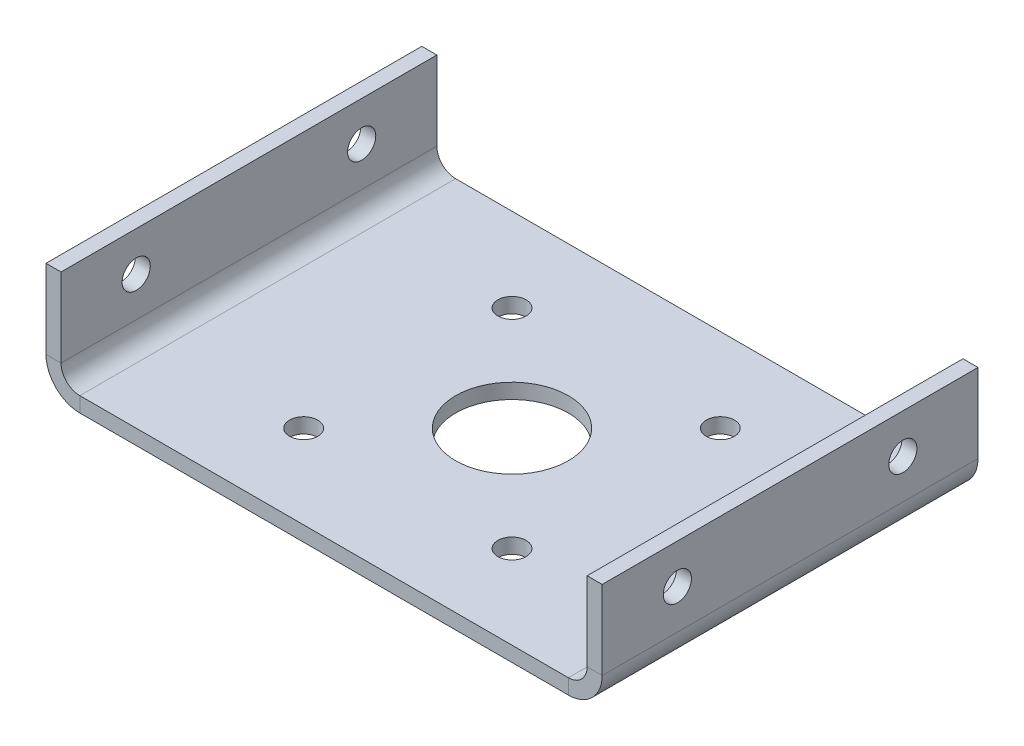
ISO-10303-21;
HEADER;
FILE_DESCRIPTION(('STEP AP214'),'2;1');
FILE_NAME('part.step','',(''),(''),'','','');
FILE_SCHEMA(('AUTOMOTIVE_DESIGN { 1 0 10303 214 1 1 1 1 }'));
ENDSEC;
DATA;
#1=APPLICATION_CONTEXT('core data for automotive mechanical design processes');
#2=APPLICATION_PROTOCOL_DEFINITION('international standard','automotive_design',2000,#1);
#3=PRODUCT_CONTEXT('',#1,'mechanical');
#4=PRODUCT('Part','Part','',(#3));
#5=PRODUCT_RELATED_PRODUCT_CATEGORY('part','',(#4));
#6=PRODUCT_DEFINITION_FORMATION('','',#4);
#7=PRODUCT_DEFINITION_CONTEXT('part definition',#1,'design');
#8=PRODUCT_DEFINITION('design','',#6,#7);
#9=PRODUCT_DEFINITION_SHAPE('','',#8);
#10=(LENGTH_UNIT() NAMED_UNIT(*) SI_UNIT(.MILLI.,.METRE.));
#11=(NAMED_UNIT(*) PLANE_ANGLE_UNIT() SI_UNIT($,.RADIAN.));
#12=(NAMED_UNIT(*) SI_UNIT($,.STERADIAN.) SOLID_ANGLE_UNIT());
#13=UNCERTAINTY_MEASURE_WITH_UNIT(LENGTH_MEASURE(1.E-05),#10,'distance_accuracy_value','');
#14=(GEOMETRIC_REPRESENTATION_CONTEXT(3) GLOBAL_UNCERTAINTY_ASSIGNED_CONTEXT((#13)) GLOBAL_UNIT_ASSIGNED_CONTEXT((#10,
#11,#12)) REPRESENTATION_CONTEXT('',''));
#15=CARTESIAN_POINT('',(0.,0.,0.));
#16=DIRECTION('',(0.,0.,1.));
#17=DIRECTION('',(1.,0.,0.));
#18=AXIS2_PLACEMENT_3D('',#15,#16,#17);
#19=CARTESIAN_POINT('',(0.,-8.,0.));
#20=DIRECTION('',(0.,-1.,0.));
#21=DIRECTION('',(0.,0.,-1.));
#22=AXIS2_PLACEMENT_3D('',#19,#20,#21);
#23=PLANE('',#22);
#24=CARTESIAN_POINT('',(-55.4371716450253,-8.,-55.4371716450253));
#25=DIRECTION('',(0.,1.,0.));
#26=DIRECTION('',(0.,0.,1.));
#27=AXIS2_PLACEMENT_3D('',#24,#25,#26);
#28=CIRCLE('',#27,7.5);
#29=CARTESIAN_POINT('',(-55.4371716450253,-8.,-47.9371716450253));
#30=VERTEX_POINT('',#29);
#31=EDGE_CURVE('E396',#30,#30,#28,.T.);
#32=ORIENTED_EDGE('',*,*,#31,.T.);
#33=EDGE_LOOP('',(#32));
#34=FACE_BOUND('',#33,.T.);
#35=CARTESIAN_POINT('',(55.4371716450253,-8.,-55.4371716450253));
#36=DIRECTION('',(0.,-1.,0.));
#37=DIRECTION('',(0.,0.,1.));
#38=AXIS2_PLACEMENT_3D('',#35,#36,#37);
#39=CIRCLE('',#38,7.5);
#40=CARTESIAN_POINT('',(55.4371716450253,-8.,-47.9371716450253));
#41=VERTEX_POINT('',#40);
#42=EDGE_CURVE('E373',#41,#41,#39,.T.);
#43=ORIENTED_EDGE('',*,*,#42,.F.);
#44=EDGE_LOOP('',(#43));
#45=FACE_BOUND('',#44,.T.);
#46=CARTESIAN_POINT('',(55.4371716450253,-8.,55.4371716450253));
#47=DIRECTION('',(0.,1.,0.));
#48=DIRECTION('',(0.,0.,-1.));
#49=AXIS2_PLACEMENT_3D('',#46,#47,#48);
#50=CIRCLE('',#49,7.5);
#51=CARTESIAN_POINT('',(55.4371716450253,-8.,47.9371716450253));
#52=VERTEX_POINT('',#51);
#53=EDGE_CURVE('E362',#52,#52,#50,.T.);
#54=ORIENTED_EDGE('',*,*,#53,.T.);
#55=EDGE_LOOP('',(#54));
#56=FACE_BOUND('',#55,.T.);
#57=CARTESIAN_POINT('',(-55.4371716450253,-8.,55.4371716450253));
#58=DIRECTION('',(0.,-1.,0.));
#59=DIRECTION('',(0.,0.,-1.));
#60=AXIS2_PLACEMENT_3D('',#57,#58,#59);
#61=CIRCLE('',#60,7.5);
#62=CARTESIAN_POINT('',(-55.4371716450253,-8.,47.9371716450253));
#63=VERTEX_POINT('',#62);
#64=EDGE_CURVE('E357',#63,#63,#61,.T.);
#65=ORIENTED_EDGE('',*,*,#64,.F.);
#66=EDGE_LOOP('',(#65));
#67=FACE_BOUND('',#66,.T.);
#68=CARTESIAN_POINT('',(0.,-8.,0.));
#69=DIRECTION('',(0.,-1.,0.));
#70=DIRECTION('',(0.,0.,-1.));
#71=AXIS2_PLACEMENT_3D('',#68,#69,#70);
#72=CIRCLE('',#71,30.);
#73=CARTESIAN_POINT('',(0.,-8.,-30.));
#74=VERTEX_POINT('',#73);
#75=EDGE_CURVE('E352',#74,#74,#72,.T.);
#76=ORIENTED_EDGE('',*,*,#75,.F.);
#77=EDGE_LOOP('',(#76));
#78=FACE_BOUND('',#77,.T.);
#79=DIRECTION('',(-1.,0.,0.));
#80=VECTOR('',#79,1.);
#81=CARTESIAN_POINT('',(-148.,-8.,-100.));
#82=LINE('',#81,#80);
#83=CARTESIAN_POINT('',(130.,-8.00000000000002,-100.));
#84=VERTEX_POINT('',#83);
#85=CARTESIAN_POINT('',(-130.,-8.,-100.));
#86=VERTEX_POINT('',#85);
#87=EDGE_CURVE('E104',#84,#86,#82,.T.);
#88=ORIENTED_EDGE('',*,*,#87,.F.);
#89=DIRECTION('',(0.,0.,-1.));
#90=VECTOR('',#89,1.);
#91=CARTESIAN_POINT('',(130.,-8.00000000000002,-100.));
#92=LINE('',#91,#90);
#93=CARTESIAN_POINT('',(130.,-8.,100.));
#94=VERTEX_POINT('',#93);
#95=EDGE_CURVE('E240',#84,#94,#92,.F.);
#96=ORIENTED_EDGE('',*,*,#95,.T.);
#97=DIRECTION('',(1.,0.,0.));
#98=VECTOR('',#97,1.);
#99=CARTESIAN_POINT('',(-148.,-8.,100.));
#100=LINE('',#99,#98);
#101=CARTESIAN_POINT('',(-130.,-8.00000000000002,100.));
#102=VERTEX_POINT('',#101);
#103=EDGE_CURVE('E15',#102,#94,#100,.T.);
#104=ORIENTED_EDGE('',*,*,#103,.F.);
#105=DIRECTION('',(0.,0.,1.));
#106=VECTOR('',#105,1.);
#107=CARTESIAN_POINT('',(-130.,-8.00000000000002,100.));
#108=LINE('',#107,#106);
#109=EDGE_CURVE('E311',#102,#86,#108,.F.);
#110=ORIENTED_EDGE('',*,*,#109,.T.);
#111=EDGE_LOOP('',(#88,#96,#104,#110));
#112=FACE_BOUND('',#111,.T.);
#113=ADVANCED_FACE('F94',(#34,#45,#56,#67,#78,#112),#23,.T.);
#114=CARTESIAN_POINT('',(0.,0.,0.));
#115=DIRECTION('',(0.,-1.,0.));
#116=DIRECTION('',(0.,0.,-1.));
#117=AXIS2_PLACEMENT_3D('',#114,#115,#116);
#118=PLANE('',#117);
#119=CARTESIAN_POINT('',(-55.4371716450253,0.,-55.4371716450253));
#120=DIRECTION('',(0.,-1.,0.));
#121=DIRECTION('',(0.,0.,-1.));
#122=AXIS2_PLACEMENT_3D('',#119,#120,#121);
#123=CIRCLE('',#122,7.5);
#124=CARTESIAN_POINT('',(-55.4371716450253,0.,-62.9371716450253));
#125=VERTEX_POINT('',#124);
#126=EDGE_CURVE('E98',#125,#125,#123,.F.);
#127=ORIENTED_EDGE('',*,*,#126,.F.);
#128=EDGE_LOOP('',(#127));
#129=FACE_BOUND('',#128,.T.);
#130=CARTESIAN_POINT('',(55.4371716450253,0.,-55.4371716450253));
#131=DIRECTION('',(0.,-1.,0.));
#132=DIRECTION('',(0.,0.,-1.));
#133=AXIS2_PLACEMENT_3D('',#130,#131,#132);
#134=CIRCLE('',#133,7.5);
#135=CARTESIAN_POINT('',(55.4371716450253,0.,-62.9371716450253));
#136=VERTEX_POINT('',#135);
#137=EDGE_CURVE('E369',#136,#136,#134,.T.);
#138=ORIENTED_EDGE('',*,*,#137,.T.);
#139=EDGE_LOOP('',(#138));
#140=FACE_BOUND('',#139,.T.);
#141=CARTESIAN_POINT('',(55.4371716450253,0.,55.4371716450253));
#142=DIRECTION('',(0.,-1.,0.));
#143=DIRECTION('',(0.,0.,-1.));
#144=AXIS2_PLACEMENT_3D('',#141,#142,#143);
#145=CIRCLE('',#144,7.5);
#146=CARTESIAN_POINT('',(55.4371716450253,0.,47.9371716450253));
#147=VERTEX_POINT('',#146);
#148=EDGE_CURVE('E358',#147,#147,#145,.F.);
#149=ORIENTED_EDGE('',*,*,#148,.F.);
#150=EDGE_LOOP('',(#149));
#151=FACE_BOUND('',#150,.T.);
#152=CARTESIAN_POINT('',(-55.4371716450253,0.,55.4371716450253));
#153=DIRECTION('',(0.,-1.,0.));
#154=DIRECTION('',(0.,0.,-1.));
#155=AXIS2_PLACEMENT_3D('',#152,#153,#154);
#156=CIRCLE('',#155,7.5);
#157=CARTESIAN_POINT('',(-55.4371716450253,0.,47.9371716450253));
#158=VERTEX_POINT('',#157);
#159=EDGE_CURVE('E353',#158,#158,#156,.T.);
#160=ORIENTED_EDGE('',*,*,#159,.T.);
#161=EDGE_LOOP('',(#160));
#162=FACE_BOUND('',#161,.T.);
#163=CARTESIAN_POINT('',(0.,0.,0.));
#164=DIRECTION('',(0.,-1.,0.));
#165=DIRECTION('',(0.,0.,-1.));
#166=AXIS2_PLACEMENT_3D('',#163,#164,#165);
#167=CIRCLE('',#166,30.);
#168=CARTESIAN_POINT('',(0.,0.,-30.));
#169=VERTEX_POINT('',#168);
#170=EDGE_CURVE('E239',#169,#169,#167,.T.);
#171=ORIENTED_EDGE('',*,*,#170,.T.);
#172=EDGE_LOOP('',(#171));
#173=FACE_BOUND('',#172,.T.);
#174=DIRECTION('',(0.,0.,-1.));
#175=VECTOR('',#174,1.);
#176=CARTESIAN_POINT('',(130.,0.,-100.));
#177=LINE('',#176,#175);
#178=CARTESIAN_POINT('',(130.,0.,-100.));
#179=VERTEX_POINT('',#178);
#180=CARTESIAN_POINT('',(130.,0.,100.));
#181=VERTEX_POINT('',#180);
#182=EDGE_CURVE('E255',#179,#181,#177,.F.);
#183=ORIENTED_EDGE('',*,*,#182,.F.);
#184=DIRECTION('',(-1.,0.,0.));
#185=VECTOR('',#184,1.);
#186=CARTESIAN_POINT('',(-148.,0.,-100.));
#187=LINE('',#186,#185);
#188=CARTESIAN_POINT('',(-130.,0.,-100.));
#189=VERTEX_POINT('',#188);
#190=EDGE_CURVE('E335',#179,#189,#187,.T.);
#191=ORIENTED_EDGE('',*,*,#190,.T.);
#192=DIRECTION('',(0.,0.,1.));
#193=VECTOR('',#192,1.);
#194=CARTESIAN_POINT('',(-130.,0.,100.));
#195=LINE('',#194,#193);
#196=CARTESIAN_POINT('',(-130.,0.,100.));
#197=VERTEX_POINT('',#196);
#198=EDGE_CURVE('E326',#197,#189,#195,.F.);
#199=ORIENTED_EDGE('',*,*,#198,.F.);
#200=DIRECTION('',(1.,0.,0.));
#201=VECTOR('',#200,1.);
#202=CARTESIAN_POINT('',(-148.,0.,100.));
#203=LINE('',#202,#201);
#204=EDGE_CURVE('E341',#197,#181,#203,.T.);
#205=ORIENTED_EDGE('',*,*,#204,.T.);
#206=EDGE_LOOP('',(#183,#191,#199,#205));
#207=FACE_BOUND('',#206,.T.);
#208=ADVANCED_FACE('F446',(#129,#140,#151,#162,#173,#207),#118,.F.);
#209=CARTESIAN_POINT('',(-148.,-8.,-100.));
#210=DIRECTION('',(0.,0.,-1.));
#211=DIRECTION('',(-1.,0.,0.));
#212=AXIS2_PLACEMENT_3D('',#209,#210,#211);
#213=PLANE('',#212);
#214=ORIENTED_EDGE('',*,*,#190,.F.);
#215=DIRECTION('',(0.,-1.,0.));
#216=VECTOR('',#215,1.);
#217=CARTESIAN_POINT('',(130.,0.,-100.));
#218=LINE('',#217,#216);
#219=EDGE_CURVE('E247',#179,#84,#218,.T.);
#220=ORIENTED_EDGE('',*,*,#219,.T.);
#221=ORIENTED_EDGE('',*,*,#87,.T.);
#222=DIRECTION('',(0.,-1.,0.));
#223=VECTOR('',#222,1.);
#224=CARTESIAN_POINT('',(-130.,0.,-100.));
#225=LINE('',#224,#223);
#226=EDGE_CURVE('E332',#189,#86,#225,.T.);
#227=ORIENTED_EDGE('',*,*,#226,.F.);
#228=EDGE_LOOP('',(#214,#220,#221,#227));
#229=FACE_BOUND('',#228,.T.);
#230=ADVANCED_FACE('F96',(#229),#213,.T.);
#231=CARTESIAN_POINT('',(-148.,-8.,100.));
#232=DIRECTION('',(0.,0.,1.));
#233=DIRECTION('',(1.,0.,0.));
#234=AXIS2_PLACEMENT_3D('',#231,#232,#233);
#235=PLANE('',#234);
#236=DIRECTION('',(0.,-1.,0.));
#237=VECTOR('',#236,1.);
#238=CARTESIAN_POINT('',(130.,0.,100.));
#239=LINE('',#238,#237);
#240=EDGE_CURVE('E262',#181,#94,#239,.T.);
#241=ORIENTED_EDGE('',*,*,#240,.F.);
#242=ORIENTED_EDGE('',*,*,#204,.F.);
#243=DIRECTION('',(0.,-1.,0.));
#244=VECTOR('',#243,1.);
#245=CARTESIAN_POINT('',(-130.,0.,100.));
#246=LINE('',#245,#244);
#247=EDGE_CURVE('E318',#197,#102,#246,.T.);
#248=ORIENTED_EDGE('',*,*,#247,.T.);
#249=ORIENTED_EDGE('',*,*,#103,.T.);
#250=EDGE_LOOP('',(#241,#242,#248,#249));
#251=FACE_BOUND('',#250,.T.);
#252=ADVANCED_FACE('F459',(#251),#235,.T.);
#253=CARTESIAN_POINT('',(-130.,9.99999999999999,-100.));
#254=DIRECTION('',(0.,0.,-1.));
#255=DIRECTION('',(-1.,0.,0.));
#256=AXIS2_PLACEMENT_3D('',#253,#254,#255);
#257=PLANE('',#256);
#258=DIRECTION('',(1.,0.,0.));
#259=VECTOR('',#258,1.);
#260=CARTESIAN_POINT('',(-148.,9.99999999999992,-100.));
#261=LINE('',#260,#259);
#262=CARTESIAN_POINT('',(-140.,9.99999999999995,-100.));
#263=VERTEX_POINT('',#262);
#264=CARTESIAN_POINT('',(-148.,9.99999999999992,-100.));
#265=VERTEX_POINT('',#264);
#266=EDGE_CURVE('E265',#263,#265,#261,.F.);
#267=ORIENTED_EDGE('',*,*,#266,.F.);
#268=CARTESIAN_POINT('',(-130.,9.99999999999999,-100.));
#269=DIRECTION('',(0.,0.,1.));
#270=DIRECTION('',(1.,0.,0.));
#271=AXIS2_PLACEMENT_3D('',#268,#269,#270);
#272=CIRCLE('',#271,10.);
#273=EDGE_CURVE('E322',#189,#263,#272,.F.);
#274=ORIENTED_EDGE('',*,*,#273,.F.);
#275=ORIENTED_EDGE('',*,*,#226,.T.);
#276=CARTESIAN_POINT('',(-130.,9.99999999999999,-100.));
#277=DIRECTION('',(0.,0.,1.));
#278=DIRECTION('',(1.,0.,0.));
#279=AXIS2_PLACEMENT_3D('',#276,#277,#278);
#280=CIRCLE('',#279,18.);
#281=EDGE_CURVE('E112',#86,#265,#280,.F.);
#282=ORIENTED_EDGE('',*,*,#281,.T.);
#283=EDGE_LOOP('',(#267,#274,#275,#282));
#284=FACE_BOUND('',#283,.T.);
#285=ADVANCED_FACE('F461',(#284),#257,.T.);
#286=CARTESIAN_POINT('',(-130.,9.99999999999999,100.));
#287=DIRECTION('',(0.,0.,-1.));
#288=DIRECTION('',(-1.,0.,0.));
#289=AXIS2_PLACEMENT_3D('',#286,#287,#288);
#290=PLANE('',#289);
#291=CARTESIAN_POINT('',(-130.,9.99999999999999,100.));
#292=DIRECTION('',(0.,0.,1.));
#293=DIRECTION('',(1.,0.,0.));
#294=AXIS2_PLACEMENT_3D('',#291,#292,#293);
#295=CIRCLE('',#294,10.);
#296=CARTESIAN_POINT('',(-140.,9.99999999999995,100.));
#297=VERTEX_POINT('',#296);
#298=EDGE_CURVE('E273',#297,#197,#295,.T.);
#299=ORIENTED_EDGE('',*,*,#298,.F.);
#300=DIRECTION('',(1.,0.,0.));
#301=VECTOR('',#300,1.);
#302=CARTESIAN_POINT('',(-140.,9.99999999999995,100.));
#303=LINE('',#302,#301);
#304=CARTESIAN_POINT('',(-148.,9.99999999999992,100.));
#305=VERTEX_POINT('',#304);
#306=EDGE_CURVE('E301',#297,#305,#303,.F.);
#307=ORIENTED_EDGE('',*,*,#306,.T.);
#308=CARTESIAN_POINT('',(-130.,9.99999999999999,100.));
#309=DIRECTION('',(0.,0.,1.));
#310=DIRECTION('',(1.,0.,0.));
#311=AXIS2_PLACEMENT_3D('',#308,#309,#310);
#312=CIRCLE('',#311,18.);
#313=EDGE_CURVE('E315',#305,#102,#312,.T.);
#314=ORIENTED_EDGE('',*,*,#313,.T.);
#315=ORIENTED_EDGE('',*,*,#247,.F.);
#316=EDGE_LOOP('',(#299,#307,#314,#315));
#317=FACE_BOUND('',#316,.T.);
#318=ADVANCED_FACE('F457',(#317),#290,.F.);
#319=CARTESIAN_POINT('',(-130.,9.99999999999999,100.));
#320=DIRECTION('',(0.,0.,1.));
#321=DIRECTION('',(-1.,0.,0.));
#322=AXIS2_PLACEMENT_3D('',#319,#320,#321);
#323=CYLINDRICAL_SURFACE('',#322,18.);
#324=ORIENTED_EDGE('',*,*,#109,.F.);
#325=ORIENTED_EDGE('',*,*,#313,.F.);
#326=DIRECTION('',(0.,0.,1.));
#327=VECTOR('',#326,1.);
#328=CARTESIAN_POINT('',(-148.,9.99999999999992,-100.));
#329=LINE('',#328,#327);
#330=EDGE_CURVE('E298',#305,#265,#329,.F.);
#331=ORIENTED_EDGE('',*,*,#330,.T.);
#332=ORIENTED_EDGE('',*,*,#281,.F.);
#333=EDGE_LOOP('',(#324,#325,#331,#332));
#334=FACE_BOUND('',#333,.T.);
#335=ADVANCED_FACE('F515',(#334),#323,.T.);
#336=CARTESIAN_POINT('',(-130.,9.99999999999999,100.));
#337=DIRECTION('',(0.,0.,1.));
#338=DIRECTION('',(-1.,0.,0.));
#339=AXIS2_PLACEMENT_3D('',#336,#337,#338);
#340=CYLINDRICAL_SURFACE('',#339,10.);
#341=ORIENTED_EDGE('',*,*,#198,.T.);
#342=ORIENTED_EDGE('',*,*,#273,.T.);
#343=DIRECTION('',(0.,0.,1.));
#344=VECTOR('',#343,1.);
#345=CARTESIAN_POINT('',(-140.,9.99999999999995,-100.));
#346=LINE('',#345,#344);
#347=EDGE_CURVE('E305',#263,#297,#346,.T.);
#348=ORIENTED_EDGE('',*,*,#347,.T.);
#349=ORIENTED_EDGE('',*,*,#298,.T.);
#350=EDGE_LOOP('',(#341,#342,#348,#349));
#351=FACE_BOUND('',#350,.T.);
#352=ADVANCED_FACE('F479',(#351),#340,.F.);
#353=CARTESIAN_POINT('',(-148.,0.,-100.));
#354=DIRECTION('',(0.,0.,1.));
#355=DIRECTION('',(1.,0.,0.));
#356=AXIS2_PLACEMENT_3D('',#353,#354,#355);
#357=PLANE('',#356);
#358=ORIENTED_EDGE('',*,*,#266,.T.);
#359=DIRECTION('',(0.,-1.,0.));
#360=VECTOR('',#359,1.);
#361=CARTESIAN_POINT('',(-148.,-5.80908318745198E-13,-100.));
#362=LINE('',#361,#360);
#363=CARTESIAN_POINT('',(-148.,52.,-100.));
#364=VERTEX_POINT('',#363);
#365=EDGE_CURVE('E284',#364,#265,#362,.T.);
#366=ORIENTED_EDGE('',*,*,#365,.F.);
#367=DIRECTION('',(1.,0.,0.));
#368=VECTOR('',#367,1.);
#369=CARTESIAN_POINT('',(-148.,52.,-100.));
#370=LINE('',#369,#368);
#371=CARTESIAN_POINT('',(-140.,52.,-100.));
#372=VERTEX_POINT('',#371);
#373=EDGE_CURVE('E274',#364,#372,#370,.T.);
#374=ORIENTED_EDGE('',*,*,#373,.T.);
#375=DIRECTION('',(0.,1.,0.));
#376=VECTOR('',#375,1.);
#377=CARTESIAN_POINT('',(-140.,0.,-100.));
#378=LINE('',#377,#376);
#379=EDGE_CURVE('E294',#372,#263,#378,.F.);
#380=ORIENTED_EDGE('',*,*,#379,.T.);
#381=EDGE_LOOP('',(#358,#366,#374,#380));
#382=FACE_BOUND('',#381,.T.);
#383=ADVANCED_FACE('F484',(#382),#357,.F.);
#384=CARTESIAN_POINT('',(-148.,52.,100.));
#385=DIRECTION('',(0.,0.,-1.));
#386=DIRECTION('',(-1.,0.,0.));
#387=AXIS2_PLACEMENT_3D('',#384,#385,#386);
#388=PLANE('',#387);
#389=ORIENTED_EDGE('',*,*,#306,.F.);
#390=DIRECTION('',(0.,-1.,0.));
#391=VECTOR('',#390,1.);
#392=CARTESIAN_POINT('',(-140.,52.,100.));
#393=LINE('',#392,#391);
#394=CARTESIAN_POINT('',(-140.,52.,100.));
#395=VERTEX_POINT('',#394);
#396=EDGE_CURVE('E291',#297,#395,#393,.F.);
#397=ORIENTED_EDGE('',*,*,#396,.T.);
#398=DIRECTION('',(1.,0.,0.));
#399=VECTOR('',#398,1.);
#400=CARTESIAN_POINT('',(-148.,52.,100.));
#401=LINE('',#400,#399);
#402=CARTESIAN_POINT('',(-148.,52.,100.));
#403=VERTEX_POINT('',#402);
#404=EDGE_CURVE('E269',#403,#395,#401,.T.);
#405=ORIENTED_EDGE('',*,*,#404,.F.);
#406=DIRECTION('',(0.,1.,0.));
#407=VECTOR('',#406,1.);
#408=CARTESIAN_POINT('',(-148.,-5.80908318745198E-13,100.));
#409=LINE('',#408,#407);
#410=EDGE_CURVE('E281',#305,#403,#409,.T.);
#411=ORIENTED_EDGE('',*,*,#410,.F.);
#412=EDGE_LOOP('',(#389,#397,#405,#411));
#413=FACE_BOUND('',#412,.T.);
#414=ADVANCED_FACE('F502',(#413),#388,.F.);
#415=CARTESIAN_POINT('',(-148.,-5.80908318745198E-13,0.));
#416=DIRECTION('',(1.,0.,0.));
#417=DIRECTION('',(0.,1.,0.));
#418=AXIS2_PLACEMENT_3D('',#415,#416,#417);
#419=PLANE('',#418);
#420=CARTESIAN_POINT('',(-148.,30.9999999999999,60.));
#421=DIRECTION('',(1.,0.,0.));
#422=DIRECTION('',(0.,-1.,0.));
#423=AXIS2_PLACEMENT_3D('',#420,#421,#422);
#424=CIRCLE('',#423,7.5);
#425=CARTESIAN_POINT('',(-148.,23.4999999999999,60.));
#426=VERTEX_POINT('',#425);
#427=EDGE_CURVE('E387',#426,#426,#424,.T.);
#428=ORIENTED_EDGE('',*,*,#427,.T.);
#429=EDGE_LOOP('',(#428));
#430=FACE_BOUND('',#429,.T.);
#431=CARTESIAN_POINT('',(-148.,30.9999999999999,-60.));
#432=DIRECTION('',(-1.,0.,0.));
#433=DIRECTION('',(0.,-1.,0.));
#434=AXIS2_PLACEMENT_3D('',#431,#432,#433);
#435=CIRCLE('',#434,7.5);
#436=CARTESIAN_POINT('',(-148.,23.4999999999999,-60.));
#437=VERTEX_POINT('',#436);
#438=EDGE_CURVE('E372',#437,#437,#435,.T.);
#439=ORIENTED_EDGE('',*,*,#438,.F.);
#440=EDGE_LOOP('',(#439));
#441=FACE_BOUND('',#440,.T.);
#442=ORIENTED_EDGE('',*,*,#330,.F.);
#443=ORIENTED_EDGE('',*,*,#410,.T.);
#444=DIRECTION('',(0.,0.,-1.));
#445=VECTOR('',#444,1.);
#446=CARTESIAN_POINT('',(-148.,52.,0.));
#447=LINE('',#446,#445);
#448=EDGE_CURVE('E278',#403,#364,#447,.T.);
#449=ORIENTED_EDGE('',*,*,#448,.T.);
#450=ORIENTED_EDGE('',*,*,#365,.T.);
#451=EDGE_LOOP('',(#442,#443,#449,#450));
#452=FACE_BOUND('',#451,.T.);
#453=ADVANCED_FACE('F488',(#430,#441,#452),#419,.F.);
#454=CARTESIAN_POINT('',(-140.,-5.52976468034453E-13,0.));
#455=DIRECTION('',(1.,0.,0.));
#456=DIRECTION('',(0.,1.,0.));
#457=AXIS2_PLACEMENT_3D('',#454,#455,#456);
#458=PLANE('',#457);
#459=CARTESIAN_POINT('',(-140.,30.9999999999999,60.));
#460=DIRECTION('',(1.,0.,0.));
#461=DIRECTION('',(0.,1.,0.));
#462=AXIS2_PLACEMENT_3D('',#459,#460,#461);
#463=CIRCLE('',#462,7.5);
#464=CARTESIAN_POINT('',(-140.,38.4999999999999,60.));
#465=VERTEX_POINT('',#464);
#466=EDGE_CURVE('E377',#465,#465,#463,.F.);
#467=ORIENTED_EDGE('',*,*,#466,.T.);
#468=EDGE_LOOP('',(#467));
#469=FACE_BOUND('',#468,.T.);
#470=CARTESIAN_POINT('',(-140.,30.9999999999999,-60.));
#471=DIRECTION('',(1.,0.,0.));
#472=DIRECTION('',(0.,1.,0.));
#473=AXIS2_PLACEMENT_3D('',#470,#471,#472);
#474=CIRCLE('',#473,7.5);
#475=CARTESIAN_POINT('',(-140.,38.4999999999999,-60.));
#476=VERTEX_POINT('',#475);
#477=EDGE_CURVE('E367',#476,#476,#474,.T.);
#478=ORIENTED_EDGE('',*,*,#477,.F.);
#479=EDGE_LOOP('',(#478));
#480=FACE_BOUND('',#479,.T.);
#481=ORIENTED_EDGE('',*,*,#396,.F.);
#482=ORIENTED_EDGE('',*,*,#347,.F.);
#483=ORIENTED_EDGE('',*,*,#379,.F.);
#484=DIRECTION('',(0.,0.,1.));
#485=VECTOR('',#484,1.);
#486=CARTESIAN_POINT('',(-140.,52.,-100.));
#487=LINE('',#486,#485);
#488=EDGE_CURVE('E288',#395,#372,#487,.F.);
#489=ORIENTED_EDGE('',*,*,#488,.F.);
#490=EDGE_LOOP('',(#481,#482,#483,#489));
#491=FACE_BOUND('',#490,.T.);
#492=ADVANCED_FACE('F498',(#469,#480,#491),#458,.T.);
#493=CARTESIAN_POINT('',(-148.,52.,-100.));
#494=DIRECTION('',(0.,-1.,0.));
#495=DIRECTION('',(1.,0.,0.));
#496=AXIS2_PLACEMENT_3D('',#493,#494,#495);
#497=PLANE('',#496);
#498=ORIENTED_EDGE('',*,*,#488,.T.);
#499=ORIENTED_EDGE('',*,*,#373,.F.);
#500=ORIENTED_EDGE('',*,*,#448,.F.);
#501=ORIENTED_EDGE('',*,*,#404,.T.);
#502=EDGE_LOOP('',(#498,#499,#500,#501));
#503=FACE_BOUND('',#502,.T.);
#504=ADVANCED_FACE('F494',(#503),#497,.F.);
#505=CARTESIAN_POINT('',(130.,9.99999999999999,100.));
#506=DIRECTION('',(0.,0.,1.));
#507=DIRECTION('',(1.,0.,0.));
#508=AXIS2_PLACEMENT_3D('',#505,#506,#507);
#509=PLANE('',#508);
#510=DIRECTION('',(-1.,0.,0.));
#511=VECTOR('',#510,1.);
#512=CARTESIAN_POINT('',(148.,9.99999999999992,100.));
#513=LINE('',#512,#511);
#514=CARTESIAN_POINT('',(140.,9.99999999999995,100.));
#515=VERTEX_POINT('',#514);
#516=CARTESIAN_POINT('',(148.,9.99999999999992,100.));
#517=VERTEX_POINT('',#516);
#518=EDGE_CURVE('E212',#515,#517,#513,.F.);
#519=ORIENTED_EDGE('',*,*,#518,.F.);
#520=CARTESIAN_POINT('',(130.,9.99999999999999,100.));
#521=DIRECTION('',(0.,0.,-1.));
#522=DIRECTION('',(-1.,0.,0.));
#523=AXIS2_PLACEMENT_3D('',#520,#521,#522);
#524=CIRCLE('',#523,10.);
#525=EDGE_CURVE('E251',#181,#515,#524,.F.);
#526=ORIENTED_EDGE('',*,*,#525,.F.);
#527=ORIENTED_EDGE('',*,*,#240,.T.);
#528=CARTESIAN_POINT('',(130.,9.99999999999999,100.));
#529=DIRECTION('',(0.,0.,-1.));
#530=DIRECTION('',(-1.,0.,0.));
#531=AXIS2_PLACEMENT_3D('',#528,#529,#530);
#532=CIRCLE('',#531,18.);
#533=EDGE_CURVE('E120',#94,#517,#532,.F.);
#534=ORIENTED_EDGE('',*,*,#533,.T.);
#535=EDGE_LOOP('',(#519,#526,#527,#534));
#536=FACE_BOUND('',#535,.T.);
#537=ADVANCED_FACE('F557',(#536),#509,.T.);
#538=CARTESIAN_POINT('',(130.,9.99999999999999,-100.));
#539=DIRECTION('',(0.,0.,1.));
#540=DIRECTION('',(1.,0.,0.));
#541=AXIS2_PLACEMENT_3D('',#538,#539,#540);
#542=PLANE('',#541);
#543=CARTESIAN_POINT('',(130.,9.99999999999999,-100.));
#544=DIRECTION('',(0.,0.,-1.));
#545=DIRECTION('',(-1.,0.,0.));
#546=AXIS2_PLACEMENT_3D('',#543,#544,#545);
#547=CIRCLE('',#546,10.);
#548=CARTESIAN_POINT('',(140.,9.99999999999995,-100.));
#549=VERTEX_POINT('',#548);
#550=EDGE_CURVE('E258',#549,#179,#547,.T.);
#551=ORIENTED_EDGE('',*,*,#550,.F.);
#552=DIRECTION('',(-1.,0.,0.));
#553=VECTOR('',#552,1.);
#554=CARTESIAN_POINT('',(140.,9.99999999999995,-100.));
#555=LINE('',#554,#553);
#556=CARTESIAN_POINT('',(148.,9.99999999999992,-100.));
#557=VERTEX_POINT('',#556);
#558=EDGE_CURVE('E230',#549,#557,#555,.F.);
#559=ORIENTED_EDGE('',*,*,#558,.T.);
#560=CARTESIAN_POINT('',(130.,9.99999999999999,-100.));
#561=DIRECTION('',(0.,0.,-1.));
#562=DIRECTION('',(-1.,0.,0.));
#563=AXIS2_PLACEMENT_3D('',#560,#561,#562);
#564=CIRCLE('',#563,18.);
#565=EDGE_CURVE('E244',#557,#84,#564,.T.);
#566=ORIENTED_EDGE('',*,*,#565,.T.);
#567=ORIENTED_EDGE('',*,*,#219,.F.);
#568=EDGE_LOOP('',(#551,#559,#566,#567));
#569=FACE_BOUND('',#568,.T.);
#570=ADVANCED_FACE('F433',(#569),#542,.F.);
#571=CARTESIAN_POINT('',(130.,9.99999999999999,-100.));
#572=DIRECTION('',(0.,0.,-1.));
#573=DIRECTION('',(1.,0.,0.));
#574=AXIS2_PLACEMENT_3D('',#571,#572,#573);
#575=CYLINDRICAL_SURFACE('',#574,18.);
#576=ORIENTED_EDGE('',*,*,#95,.F.);
#577=ORIENTED_EDGE('',*,*,#565,.F.);
#578=DIRECTION('',(0.,0.,-1.));
#579=VECTOR('',#578,1.);
#580=CARTESIAN_POINT('',(148.,9.99999999999992,100.));
#581=LINE('',#580,#579);
#582=EDGE_CURVE('E227',#557,#517,#581,.F.);
#583=ORIENTED_EDGE('',*,*,#582,.T.);
#584=ORIENTED_EDGE('',*,*,#533,.F.);
#585=EDGE_LOOP('',(#576,#577,#583,#584));
#586=FACE_BOUND('',#585,.T.);
#587=ADVANCED_FACE('F573',(#586),#575,.T.);
#588=CARTESIAN_POINT('',(130.,9.99999999999999,-100.));
#589=DIRECTION('',(0.,0.,-1.));
#590=DIRECTION('',(1.,0.,0.));
#591=AXIS2_PLACEMENT_3D('',#588,#589,#590);
#592=CYLINDRICAL_SURFACE('',#591,10.);
#593=ORIENTED_EDGE('',*,*,#182,.T.);
#594=ORIENTED_EDGE('',*,*,#525,.T.);
#595=DIRECTION('',(0.,0.,-1.));
#596=VECTOR('',#595,1.);
#597=CARTESIAN_POINT('',(140.,9.99999999999995,100.));
#598=LINE('',#597,#596);
#599=EDGE_CURVE('E234',#515,#549,#598,.T.);
#600=ORIENTED_EDGE('',*,*,#599,.T.);
#601=ORIENTED_EDGE('',*,*,#550,.T.);
#602=EDGE_LOOP('',(#593,#594,#600,#601));
#603=FACE_BOUND('',#602,.T.);
#604=ADVANCED_FACE('F428',(#603),#592,.F.);
#605=CARTESIAN_POINT('',(148.,0.,100.));
#606=DIRECTION('',(0.,0.,-1.));
#607=DIRECTION('',(-1.,0.,0.));
#608=AXIS2_PLACEMENT_3D('',#605,#606,#607);
#609=PLANE('',#608);
#610=ORIENTED_EDGE('',*,*,#518,.T.);
#611=DIRECTION('',(0.,-1.,0.));
#612=VECTOR('',#611,1.);
#613=CARTESIAN_POINT('',(148.,-5.80908318745198E-13,100.));
#614=LINE('',#613,#612);
#615=CARTESIAN_POINT('',(148.,52.,100.));
#616=VERTEX_POINT('',#615);
#617=EDGE_CURVE('E191',#616,#517,#614,.T.);
#618=ORIENTED_EDGE('',*,*,#617,.F.);
#619=DIRECTION('',(-1.,0.,0.));
#620=VECTOR('',#619,1.);
#621=CARTESIAN_POINT('',(148.,52.,100.));
#622=LINE('',#621,#620);
#623=CARTESIAN_POINT('',(140.,52.,100.));
#624=VERTEX_POINT('',#623);
#625=EDGE_CURVE('E198',#616,#624,#622,.T.);
#626=ORIENTED_EDGE('',*,*,#625,.T.);
#627=DIRECTION('',(0.,1.,0.));
#628=VECTOR('',#627,1.);
#629=CARTESIAN_POINT('',(140.,0.,100.));
#630=LINE('',#629,#628);
#631=EDGE_CURVE('E224',#624,#515,#630,.F.);
#632=ORIENTED_EDGE('',*,*,#631,.T.);
#633=EDGE_LOOP('',(#610,#618,#626,#632));
#634=FACE_BOUND('',#633,.T.);
#635=ADVANCED_FACE('F211',(#634),#609,.F.);
#636=CARTESIAN_POINT('',(148.,52.,-100.));
#637=DIRECTION('',(0.,0.,1.));
#638=DIRECTION('',(1.,0.,0.));
#639=AXIS2_PLACEMENT_3D('',#636,#637,#638);
#640=PLANE('',#639);
#641=ORIENTED_EDGE('',*,*,#558,.F.);
#642=DIRECTION('',(0.,-1.,0.));
#643=VECTOR('',#642,1.);
#644=CARTESIAN_POINT('',(140.,52.,-100.));
#645=LINE('',#644,#643);
#646=CARTESIAN_POINT('',(140.,52.,-100.));
#647=VERTEX_POINT('',#646);
#648=EDGE_CURVE('E219',#549,#647,#645,.F.);
#649=ORIENTED_EDGE('',*,*,#648,.T.);
#650=DIRECTION('',(-1.,0.,0.));
#651=VECTOR('',#650,1.);
#652=CARTESIAN_POINT('',(148.,52.,-100.));
#653=LINE('',#652,#651);
#654=CARTESIAN_POINT('',(148.,52.,-100.));
#655=VERTEX_POINT('',#654);
#656=EDGE_CURVE('E208',#655,#647,#653,.T.);
#657=ORIENTED_EDGE('',*,*,#656,.F.);
#658=DIRECTION('',(0.,1.,0.));
#659=VECTOR('',#658,1.);
#660=CARTESIAN_POINT('',(148.,-5.80908318745198E-13,-100.));
#661=LINE('',#660,#659);
#662=EDGE_CURVE('E193',#557,#655,#661,.T.);
#663=ORIENTED_EDGE('',*,*,#662,.F.);
#664=EDGE_LOOP('',(#641,#649,#657,#663));
#665=FACE_BOUND('',#664,.T.);
#666=ADVANCED_FACE('F434',(#665),#640,.F.);
#667=CARTESIAN_POINT('',(148.,-5.80908318745198E-13,0.));
#668=DIRECTION('',(-1.,0.,0.));
#669=DIRECTION('',(0.,-1.,0.));
#670=AXIS2_PLACEMENT_3D('',#667,#668,#669);
#671=PLANE('',#670);
#672=CARTESIAN_POINT('',(148.,31.000000000001,60.));
#673=DIRECTION('',(1.,0.,0.));
#674=DIRECTION('',(0.,-1.,0.));
#675=AXIS2_PLACEMENT_3D('',#672,#673,#674);
#676=CIRCLE('',#675,7.5);
#677=CARTESIAN_POINT('',(148.,23.500000000001,60.));
#678=VERTEX_POINT('',#677);
#679=EDGE_CURVE('E378',#678,#678,#676,.T.);
#680=ORIENTED_EDGE('',*,*,#679,.F.);
#681=EDGE_LOOP('',(#680));
#682=FACE_BOUND('',#681,.T.);
#683=CARTESIAN_POINT('',(148.,31.000000000001,-60.));
#684=DIRECTION('',(-1.,0.,0.));
#685=DIRECTION('',(0.,-1.,0.));
#686=AXIS2_PLACEMENT_3D('',#683,#684,#685);
#687=CIRCLE('',#686,7.5);
#688=CARTESIAN_POINT('',(148.,23.500000000001,-60.));
#689=VERTEX_POINT('',#688);
#690=EDGE_CURVE('E368',#689,#689,#687,.T.);
#691=ORIENTED_EDGE('',*,*,#690,.T.);
#692=EDGE_LOOP('',(#691));
#693=FACE_BOUND('',#692,.T.);
#694=ORIENTED_EDGE('',*,*,#582,.F.);
#695=ORIENTED_EDGE('',*,*,#662,.T.);
#696=DIRECTION('',(0.,0.,1.));
#697=VECTOR('',#696,1.);
#698=CARTESIAN_POINT('',(148.,52.,0.));
#699=LINE('',#698,#697);
#700=EDGE_CURVE('E186',#655,#616,#699,.T.);
#701=ORIENTED_EDGE('',*,*,#700,.T.);
#702=ORIENTED_EDGE('',*,*,#617,.T.);
#703=EDGE_LOOP('',(#694,#695,#701,#702));
#704=FACE_BOUND('',#703,.T.);
#705=ADVANCED_FACE('F189',(#682,#693,#704),#671,.F.);
#706=CARTESIAN_POINT('',(140.,-5.52976468034453E-13,0.));
#707=DIRECTION('',(-1.,0.,0.));
#708=DIRECTION('',(0.,-1.,0.));
#709=AXIS2_PLACEMENT_3D('',#706,#707,#708);
#710=PLANE('',#709);
#711=CARTESIAN_POINT('',(140.,31.0000000000009,60.));
#712=DIRECTION('',(-1.,0.,0.));
#713=DIRECTION('',(0.,-1.,0.));
#714=AXIS2_PLACEMENT_3D('',#711,#712,#713);
#715=CIRCLE('',#714,7.5);
#716=CARTESIAN_POINT('',(140.,23.5000000000009,60.));
#717=VERTEX_POINT('',#716);
#718=EDGE_CURVE('E374',#717,#717,#715,.F.);
#719=ORIENTED_EDGE('',*,*,#718,.T.);
#720=EDGE_LOOP('',(#719));
#721=FACE_BOUND('',#720,.T.);
#722=CARTESIAN_POINT('',(140.,31.0000000000009,-60.));
#723=DIRECTION('',(-1.,0.,0.));
#724=DIRECTION('',(0.,-1.,0.));
#725=AXIS2_PLACEMENT_3D('',#722,#723,#724);
#726=CIRCLE('',#725,7.5);
#727=CARTESIAN_POINT('',(140.,23.5000000000009,-60.));
#728=VERTEX_POINT('',#727);
#729=EDGE_CURVE('E363',#728,#728,#726,.T.);
#730=ORIENTED_EDGE('',*,*,#729,.F.);
#731=EDGE_LOOP('',(#730));
#732=FACE_BOUND('',#731,.T.);
#733=ORIENTED_EDGE('',*,*,#648,.F.);
#734=ORIENTED_EDGE('',*,*,#599,.F.);
#735=ORIENTED_EDGE('',*,*,#631,.F.);
#736=DIRECTION('',(0.,0.,-1.));
#737=VECTOR('',#736,1.);
#738=CARTESIAN_POINT('',(140.,52.,100.));
#739=LINE('',#738,#737);
#740=EDGE_CURVE('E203',#647,#624,#739,.F.);
#741=ORIENTED_EDGE('',*,*,#740,.F.);
#742=EDGE_LOOP('',(#733,#734,#735,#741));
#743=FACE_BOUND('',#742,.T.);
#744=ADVANCED_FACE('F424',(#721,#732,#743),#710,.T.);
#745=CARTESIAN_POINT('',(148.,52.,100.));
#746=DIRECTION('',(0.,-1.,0.));
#747=DIRECTION('',(1.,0.,0.));
#748=AXIS2_PLACEMENT_3D('',#745,#746,#747);
#749=PLANE('',#748);
#750=ORIENTED_EDGE('',*,*,#740,.T.);
#751=ORIENTED_EDGE('',*,*,#625,.F.);
#752=ORIENTED_EDGE('',*,*,#700,.F.);
#753=ORIENTED_EDGE('',*,*,#656,.T.);
#754=EDGE_LOOP('',(#750,#751,#752,#753));
#755=FACE_BOUND('',#754,.T.);
#756=ADVANCED_FACE('F201',(#755),#749,.F.);
#757=CARTESIAN_POINT('',(0.,2.,0.));
#758=DIRECTION('',(0.,-1.,0.));
#759=DIRECTION('',(0.,0.,-1.));
#760=AXIS2_PLACEMENT_3D('',#757,#758,#759);
#761=CYLINDRICAL_SURFACE('',#760,30.);
#762=ORIENTED_EDGE('',*,*,#75,.T.);
#763=EDGE_LOOP('',(#762));
#764=FACE_BOUND('',#763,.T.);
#765=ORIENTED_EDGE('',*,*,#170,.F.);
#766=EDGE_LOOP('',(#765));
#767=FACE_BOUND('',#766,.T.);
#768=ADVANCED_FACE('F622',(#764,#767),#761,.F.);
#769=CARTESIAN_POINT('',(-55.4371716450253,2.,55.4371716450253));
#770=DIRECTION('',(0.,-1.,0.));
#771=DIRECTION('',(0.,0.,-1.));
#772=AXIS2_PLACEMENT_3D('',#769,#770,#771);
#773=CYLINDRICAL_SURFACE('',#772,7.5);
#774=ORIENTED_EDGE('',*,*,#64,.T.);
#775=EDGE_LOOP('',(#774));
#776=FACE_BOUND('',#775,.T.);
#777=ORIENTED_EDGE('',*,*,#159,.F.);
#778=EDGE_LOOP('',(#777));
#779=FACE_BOUND('',#778,.T.);
#780=ADVANCED_FACE('F630',(#776,#779),#773,.F.);
#781=CARTESIAN_POINT('',(55.4371716450253,2.,55.4371716450253));
#782=DIRECTION('',(0.,-1.,0.));
#783=DIRECTION('',(0.,0.,-1.));
#784=AXIS2_PLACEMENT_3D('',#781,#782,#783);
#785=CYLINDRICAL_SURFACE('',#784,7.5);
#786=ORIENTED_EDGE('',*,*,#53,.F.);
#787=EDGE_LOOP('',(#786));
#788=FACE_BOUND('',#787,.T.);
#789=ORIENTED_EDGE('',*,*,#148,.T.);
#790=EDGE_LOOP('',(#789));
#791=FACE_BOUND('',#790,.T.);
#792=ADVANCED_FACE('F640',(#788,#791),#785,.F.);
#793=CARTESIAN_POINT('',(148.,31.000000000001,-60.));
#794=DIRECTION('',(-1.,0.,0.));
#795=DIRECTION('',(0.,-1.,0.));
#796=AXIS2_PLACEMENT_3D('',#793,#794,#795);
#797=CYLINDRICAL_SURFACE('',#796,7.5);
#798=ORIENTED_EDGE('',*,*,#729,.T.);
#799=EDGE_LOOP('',(#798));
#800=FACE_BOUND('',#799,.T.);
#801=ORIENTED_EDGE('',*,*,#690,.F.);
#802=EDGE_LOOP('',(#801));
#803=FACE_BOUND('',#802,.T.);
#804=ADVANCED_FACE('F650',(#800,#803),#797,.F.);
#805=ORIENTED_EDGE('',*,*,#477,.T.);
#806=EDGE_LOOP('',(#805));
#807=FACE_BOUND('',#806,.T.);
#808=ORIENTED_EDGE('',*,*,#438,.T.);
#809=EDGE_LOOP('',(#808));
#810=FACE_BOUND('',#809,.T.);
#811=ADVANCED_FACE('F660',(#807,#810),#797,.F.);
#812=CARTESIAN_POINT('',(55.4371716450253,2.,-55.4371716450253));
#813=DIRECTION('',(0.,-1.,0.));
#814=DIRECTION('',(0.,0.,-1.));
#815=AXIS2_PLACEMENT_3D('',#812,#813,#814);
#816=CYLINDRICAL_SURFACE('',#815,7.5);
#817=ORIENTED_EDGE('',*,*,#42,.T.);
#818=EDGE_LOOP('',(#817));
#819=FACE_BOUND('',#818,.T.);
#820=ORIENTED_EDGE('',*,*,#137,.F.);
#821=EDGE_LOOP('',(#820));
#822=FACE_BOUND('',#821,.T.);
#823=ADVANCED_FACE('F670',(#819,#822),#816,.F.);
#824=CARTESIAN_POINT('',(148.,31.000000000001,60.));
#825=DIRECTION('',(-1.,0.,0.));
#826=DIRECTION('',(0.,-1.,0.));
#827=AXIS2_PLACEMENT_3D('',#824,#825,#826);
#828=CYLINDRICAL_SURFACE('',#827,7.5);
#829=ORIENTED_EDGE('',*,*,#718,.F.);
#830=EDGE_LOOP('',(#829));
#831=FACE_BOUND('',#830,.T.);
#832=ORIENTED_EDGE('',*,*,#679,.T.);
#833=EDGE_LOOP('',(#832));
#834=FACE_BOUND('',#833,.T.);
#835=ADVANCED_FACE('F679',(#831,#834),#828,.F.);
#836=ORIENTED_EDGE('',*,*,#466,.F.);
#837=EDGE_LOOP('',(#836));
#838=FACE_BOUND('',#837,.T.);
#839=ORIENTED_EDGE('',*,*,#427,.F.);
#840=EDGE_LOOP('',(#839));
#841=FACE_BOUND('',#840,.T.);
#842=ADVANCED_FACE('F689',(#838,#841),#828,.F.);
#843=CARTESIAN_POINT('',(-55.4371716450253,2.,-55.4371716450253));
#844=DIRECTION('',(0.,-1.,0.));
#845=DIRECTION('',(0.,0.,-1.));
#846=AXIS2_PLACEMENT_3D('',#843,#844,#845);
#847=CYLINDRICAL_SURFACE('',#846,7.5);
#848=ORIENTED_EDGE('',*,*,#31,.F.);
#849=EDGE_LOOP('',(#848));
#850=FACE_BOUND('',#849,.T.);
#851=ORIENTED_EDGE('',*,*,#126,.T.);
#852=EDGE_LOOP('',(#851));
#853=FACE_BOUND('',#852,.T.);
#854=ADVANCED_FACE('F699',(#850,#853),#847,.F.);
#855=CLOSED_SHELL('',(#113,#208,#230,#252,#285,#318,#335,#352,#383,#414,#453,#492,#504,#537,
#570,#587,#604,#635,#666,#705,#744,#756,#768,#780,#792,#804,#811,#823,#835,#842,#854));
#856=MANIFOLD_SOLID_BREP('B2',#855);
#857=ADVANCED_BREP_SHAPE_REPRESENTATION('',(#18,#856),#14);
#858=SHAPE_DEFINITION_REPRESENTATION(#9,#857);
ENDSEC;
END-ISO-10303-21;
